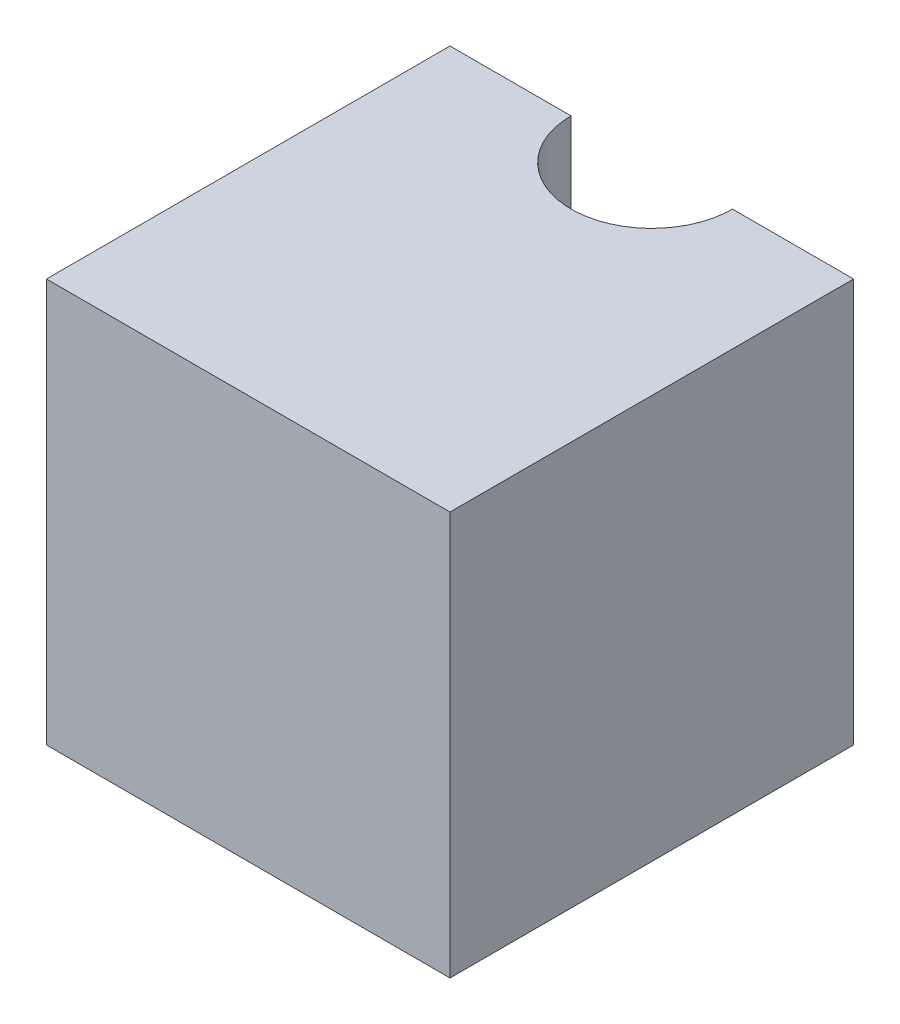
ISO-10303-21;
HEADER;
FILE_DESCRIPTION(('STEP AP214'),'2;1');
FILE_NAME('part.step','',(''),(''),'','','');
FILE_SCHEMA(('AUTOMOTIVE_DESIGN { 1 0 10303 214 1 1 1 1 }'));
ENDSEC;
DATA;
#1=APPLICATION_CONTEXT('core data for automotive mechanical design processes');
#2=APPLICATION_PROTOCOL_DEFINITION('international standard','automotive_design',2000,#1);
#3=PRODUCT_CONTEXT('',#1,'mechanical');
#4=PRODUCT('Part','Part','',(#3));
#5=PRODUCT_RELATED_PRODUCT_CATEGORY('part','',(#4));
#6=PRODUCT_DEFINITION_FORMATION('','',#4);
#7=PRODUCT_DEFINITION_CONTEXT('part definition',#1,'design');
#8=PRODUCT_DEFINITION('design','',#6,#7);
#9=PRODUCT_DEFINITION_SHAPE('','',#8);
#10=(LENGTH_UNIT() NAMED_UNIT(*) SI_UNIT(.MILLI.,.METRE.));
#11=(NAMED_UNIT(*) PLANE_ANGLE_UNIT() SI_UNIT($,.RADIAN.));
#12=(NAMED_UNIT(*) SI_UNIT($,.STERADIAN.) SOLID_ANGLE_UNIT());
#13=UNCERTAINTY_MEASURE_WITH_UNIT(LENGTH_MEASURE(1.E-05),#10,'distance_accuracy_value','');
#14=(GEOMETRIC_REPRESENTATION_CONTEXT(3) GLOBAL_UNCERTAINTY_ASSIGNED_CONTEXT((#13)) GLOBAL_UNIT_ASSIGNED_CONTEXT((#10,
#11,#12)) REPRESENTATION_CONTEXT('',''));
#15=CARTESIAN_POINT('',(0.,0.,0.));
#16=DIRECTION('',(0.,0.,1.));
#17=DIRECTION('',(1.,0.,0.));
#18=AXIS2_PLACEMENT_3D('',#15,#16,#17);
#19=CARTESIAN_POINT('',(0.,0.,0.));
#20=DIRECTION('',(0.,0.,-1.));
#21=DIRECTION('',(-1.,0.,0.));
#22=AXIS2_PLACEMENT_3D('',#19,#20,#21);
#23=PLANE('',#22);
#24=DIRECTION('',(0.,1.,0.));
#25=VECTOR('',#24,1.);
#26=CARTESIAN_POINT('',(-20.,-50.,0.));
#27=LINE('',#26,#25);
#28=CARTESIAN_POINT('',(-20.,-50.,0.));
#29=VERTEX_POINT('',#28);
#30=CARTESIAN_POINT('',(-20.,50.,0.));
#31=VERTEX_POINT('',#30);
#32=EDGE_CURVE('E11',#29,#31,#27,.T.);
#33=ORIENTED_EDGE('',*,*,#32,.F.);
#34=DIRECTION('',(1.,0.,0.));
#35=VECTOR('',#34,1.);
#36=CARTESIAN_POINT('',(-50.,-50.,0.));
#37=LINE('',#36,#35);
#38=CARTESIAN_POINT('',(-50.,-50.,0.));
#39=VERTEX_POINT('',#38);
#40=EDGE_CURVE('E122',#39,#29,#37,.T.);
#41=ORIENTED_EDGE('',*,*,#40,.F.);
#42=DIRECTION('',(0.,-1.,0.));
#43=VECTOR('',#42,1.);
#44=CARTESIAN_POINT('',(-50.,-50.,0.));
#45=LINE('',#44,#43);
#46=CARTESIAN_POINT('',(-50.,50.,0.));
#47=VERTEX_POINT('',#46);
#48=EDGE_CURVE('E114',#47,#39,#45,.T.);
#49=ORIENTED_EDGE('',*,*,#48,.F.);
#50=DIRECTION('',(-1.,0.,0.));
#51=VECTOR('',#50,1.);
#52=CARTESIAN_POINT('',(-50.,50.,0.));
#53=LINE('',#52,#51);
#54=EDGE_CURVE('E109',#31,#47,#53,.T.);
#55=ORIENTED_EDGE('',*,*,#54,.F.);
#56=EDGE_LOOP('',(#33,#41,#49,#55));
#57=FACE_BOUND('',#56,.T.);
#58=ADVANCED_FACE('F41',(#57),#23,.T.);
#59=CARTESIAN_POINT('',(50.,-50.,100.));
#60=DIRECTION('',(-1.,0.,0.));
#61=DIRECTION('',(0.,0.,1.));
#62=AXIS2_PLACEMENT_3D('',#59,#60,#61);
#63=PLANE('',#62);
#64=DIRECTION('',(0.,1.,0.));
#65=VECTOR('',#64,1.);
#66=CARTESIAN_POINT('',(50.,-50.,0.));
#67=LINE('',#66,#65);
#68=CARTESIAN_POINT('',(50.,-50.,0.));
#69=VERTEX_POINT('',#68);
#70=CARTESIAN_POINT('',(50.,50.,0.));
#71=VERTEX_POINT('',#70);
#72=EDGE_CURVE('E115',#69,#71,#67,.T.);
#73=ORIENTED_EDGE('',*,*,#72,.T.);
#74=DIRECTION('',(0.,0.,-1.));
#75=VECTOR('',#74,1.);
#76=CARTESIAN_POINT('',(50.,50.,100.));
#77=LINE('',#76,#75);
#78=CARTESIAN_POINT('',(50.,50.,100.));
#79=VERTEX_POINT('',#78);
#80=EDGE_CURVE('E132',#79,#71,#77,.T.);
#81=ORIENTED_EDGE('',*,*,#80,.F.);
#82=DIRECTION('',(0.,1.,0.));
#83=VECTOR('',#82,1.);
#84=CARTESIAN_POINT('',(50.,-50.,100.));
#85=LINE('',#84,#83);
#86=CARTESIAN_POINT('',(50.,-50.,100.));
#87=VERTEX_POINT('',#86);
#88=EDGE_CURVE('E124',#87,#79,#85,.T.);
#89=ORIENTED_EDGE('',*,*,#88,.F.);
#90=DIRECTION('',(0.,0.,-1.));
#91=VECTOR('',#90,1.);
#92=CARTESIAN_POINT('',(50.,-50.,100.));
#93=LINE('',#92,#91);
#94=EDGE_CURVE('E125',#87,#69,#93,.T.);
#95=ORIENTED_EDGE('',*,*,#94,.T.);
#96=EDGE_LOOP('',(#73,#81,#89,#95));
#97=FACE_BOUND('',#96,.T.);
#98=ADVANCED_FACE('F43',(#97),#63,.F.);
#99=CARTESIAN_POINT('',(-50.,50.,100.));
#100=DIRECTION('',(0.,-1.,0.));
#101=DIRECTION('',(0.,0.,-1.));
#102=AXIS2_PLACEMENT_3D('',#99,#100,#101);
#103=PLANE('',#102);
#104=CARTESIAN_POINT('',(20.,50.,0.));
#105=VERTEX_POINT('',#104);
#106=EDGE_CURVE('E111',#71,#105,#53,.T.);
#107=ORIENTED_EDGE('',*,*,#106,.T.);
#108=CARTESIAN_POINT('',(0.,50.,0.));
#109=DIRECTION('',(0.,1.,0.));
#110=DIRECTION('',(0.,0.,1.));
#111=AXIS2_PLACEMENT_3D('',#108,#109,#110);
#112=CIRCLE('',#111,20.);
#113=EDGE_CURVE('E55',#31,#105,#112,.T.);
#114=ORIENTED_EDGE('',*,*,#113,.F.);
#115=ORIENTED_EDGE('',*,*,#54,.T.);
#116=DIRECTION('',(0.,0.,-1.));
#117=VECTOR('',#116,1.);
#118=CARTESIAN_POINT('',(-50.,50.,100.));
#119=LINE('',#118,#117);
#120=CARTESIAN_POINT('',(-50.,50.,100.));
#121=VERTEX_POINT('',#120);
#122=EDGE_CURVE('E130',#121,#47,#119,.T.);
#123=ORIENTED_EDGE('',*,*,#122,.F.);
#124=DIRECTION('',(-1.,0.,0.));
#125=VECTOR('',#124,1.);
#126=CARTESIAN_POINT('',(-50.,50.,100.));
#127=LINE('',#126,#125);
#128=EDGE_CURVE('E93',#79,#121,#127,.T.);
#129=ORIENTED_EDGE('',*,*,#128,.F.);
#130=ORIENTED_EDGE('',*,*,#80,.T.);
#131=EDGE_LOOP('',(#107,#114,#115,#123,#129,#130));
#132=FACE_BOUND('',#131,.T.);
#133=ADVANCED_FACE('F108',(#132),#103,.F.);
#134=CARTESIAN_POINT('',(-50.,-50.,100.));
#135=DIRECTION('',(1.,0.,0.));
#136=DIRECTION('',(0.,0.,-1.));
#137=AXIS2_PLACEMENT_3D('',#134,#135,#136);
#138=PLANE('',#137);
#139=ORIENTED_EDGE('',*,*,#48,.T.);
#140=DIRECTION('',(0.,0.,-1.));
#141=VECTOR('',#140,1.);
#142=CARTESIAN_POINT('',(-50.,-50.,100.));
#143=LINE('',#142,#141);
#144=CARTESIAN_POINT('',(-50.,-50.,100.));
#145=VERTEX_POINT('',#144);
#146=EDGE_CURVE('E127',#145,#39,#143,.T.);
#147=ORIENTED_EDGE('',*,*,#146,.F.);
#148=DIRECTION('',(0.,-1.,0.));
#149=VECTOR('',#148,1.);
#150=CARTESIAN_POINT('',(-50.,-50.,100.));
#151=LINE('',#150,#149);
#152=EDGE_CURVE('E142',#121,#145,#151,.T.);
#153=ORIENTED_EDGE('',*,*,#152,.F.);
#154=ORIENTED_EDGE('',*,*,#122,.T.);
#155=EDGE_LOOP('',(#139,#147,#153,#154));
#156=FACE_BOUND('',#155,.T.);
#157=ADVANCED_FACE('F149',(#156),#138,.F.);
#158=CARTESIAN_POINT('',(-50.,-50.,100.));
#159=DIRECTION('',(0.,1.,0.));
#160=DIRECTION('',(0.,0.,1.));
#161=AXIS2_PLACEMENT_3D('',#158,#159,#160);
#162=PLANE('',#161);
#163=ORIENTED_EDGE('',*,*,#40,.T.);
#164=CARTESIAN_POINT('',(0.,-50.,0.));
#165=DIRECTION('',(0.,1.,0.));
#166=DIRECTION('',(0.,0.,1.));
#167=AXIS2_PLACEMENT_3D('',#164,#165,#166);
#168=CIRCLE('',#167,20.);
#169=CARTESIAN_POINT('',(20.,-50.,0.));
#170=VERTEX_POINT('',#169);
#171=EDGE_CURVE('E102',#29,#170,#168,.T.);
#172=ORIENTED_EDGE('',*,*,#171,.T.);
#173=EDGE_CURVE('E85',#170,#69,#37,.T.);
#174=ORIENTED_EDGE('',*,*,#173,.T.);
#175=ORIENTED_EDGE('',*,*,#94,.F.);
#176=DIRECTION('',(1.,0.,0.));
#177=VECTOR('',#176,1.);
#178=CARTESIAN_POINT('',(-50.,-50.,100.));
#179=LINE('',#178,#177);
#180=EDGE_CURVE('E64',#145,#87,#179,.T.);
#181=ORIENTED_EDGE('',*,*,#180,.F.);
#182=ORIENTED_EDGE('',*,*,#146,.T.);
#183=EDGE_LOOP('',(#163,#172,#174,#175,#181,#182));
#184=FACE_BOUND('',#183,.T.);
#185=ADVANCED_FACE('F134',(#184),#162,.F.);
#186=CARTESIAN_POINT('',(0.,0.,100.));
#187=DIRECTION('',(0.,0.,-1.));
#188=DIRECTION('',(-1.,0.,0.));
#189=AXIS2_PLACEMENT_3D('',#186,#187,#188);
#190=PLANE('',#189);
#191=ORIENTED_EDGE('',*,*,#88,.T.);
#192=ORIENTED_EDGE('',*,*,#128,.T.);
#193=ORIENTED_EDGE('',*,*,#152,.T.);
#194=ORIENTED_EDGE('',*,*,#180,.T.);
#195=EDGE_LOOP('',(#191,#192,#193,#194));
#196=FACE_BOUND('',#195,.T.);
#197=ADVANCED_FACE('F146',(#196),#190,.F.);
#198=DIRECTION('',(0.,1.,0.));
#199=VECTOR('',#198,1.);
#200=CARTESIAN_POINT('',(20.,-50.,0.));
#201=LINE('',#200,#199);
#202=EDGE_CURVE('E49',#105,#170,#201,.F.);
#203=ORIENTED_EDGE('',*,*,#202,.F.);
#204=ORIENTED_EDGE('',*,*,#106,.F.);
#205=ORIENTED_EDGE('',*,*,#72,.F.);
#206=ORIENTED_EDGE('',*,*,#173,.F.);
#207=EDGE_LOOP('',(#203,#204,#205,#206));
#208=FACE_BOUND('',#207,.T.);
#209=ADVANCED_FACE('F137',(#208),#23,.T.);
#210=CARTESIAN_POINT('',(0.,-50.,0.));
#211=DIRECTION('',(0.,1.,0.));
#212=DIRECTION('',(0.,0.,1.));
#213=AXIS2_PLACEMENT_3D('',#210,#211,#212);
#214=CYLINDRICAL_SURFACE('',#213,20.);
#215=ORIENTED_EDGE('',*,*,#32,.T.);
#216=ORIENTED_EDGE('',*,*,#113,.T.);
#217=ORIENTED_EDGE('',*,*,#202,.T.);
#218=ORIENTED_EDGE('',*,*,#171,.F.);
#219=EDGE_LOOP('',(#215,#216,#217,#218));
#220=FACE_BOUND('',#219,.T.);
#221=ADVANCED_FACE('F101',(#220),#214,.F.);
#222=CLOSED_SHELL('',(#58,#98,#133,#157,#185,#197,#209,#221));
#223=MANIFOLD_SOLID_BREP('B2',#222);
#224=ADVANCED_BREP_SHAPE_REPRESENTATION('',(#18,#223),#14);
#225=SHAPE_DEFINITION_REPRESENTATION(#9,#224);
ENDSEC;
END-ISO-10303-21;
